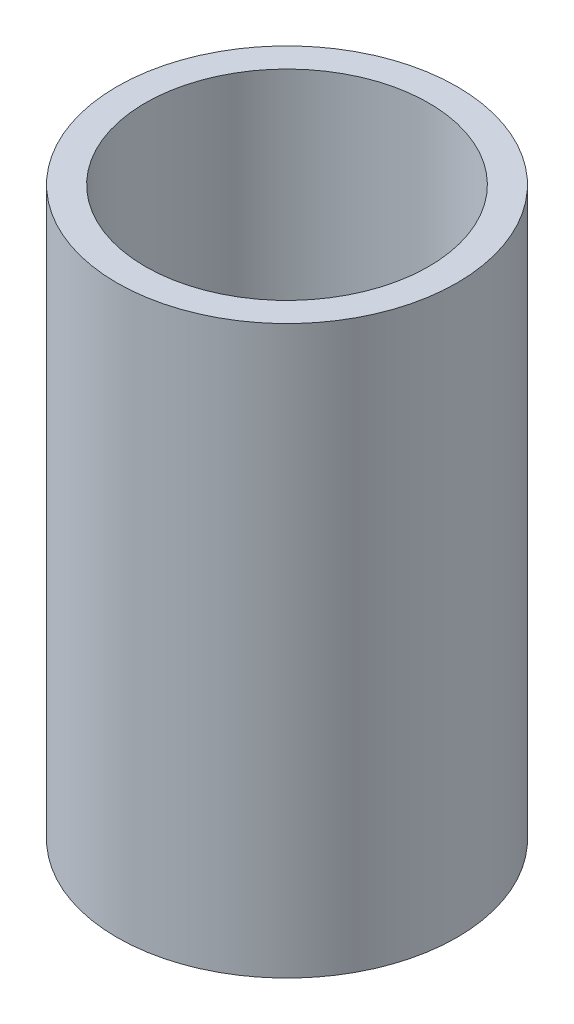
ISO-10303-21;
HEADER;
FILE_DESCRIPTION(('STEP AP214'),'2;1');
FILE_NAME('part.step','',(''),(''),'','','');
FILE_SCHEMA(('AUTOMOTIVE_DESIGN { 1 0 10303 214 1 1 1 1 }'));
ENDSEC;
DATA;
#1=APPLICATION_CONTEXT('core data for automotive mechanical design processes');
#2=APPLICATION_PROTOCOL_DEFINITION('international standard','automotive_design',2000,#1);
#3=PRODUCT_CONTEXT('',#1,'mechanical');
#4=PRODUCT('Part','Part','',(#3));
#5=PRODUCT_RELATED_PRODUCT_CATEGORY('part','',(#4));
#6=PRODUCT_DEFINITION_FORMATION('','',#4);
#7=PRODUCT_DEFINITION_CONTEXT('part definition',#1,'design');
#8=PRODUCT_DEFINITION('design','',#6,#7);
#9=PRODUCT_DEFINITION_SHAPE('','',#8);
#10=(LENGTH_UNIT() NAMED_UNIT(*) SI_UNIT(.MILLI.,.METRE.));
#11=(NAMED_UNIT(*) PLANE_ANGLE_UNIT() SI_UNIT($,.RADIAN.));
#12=(NAMED_UNIT(*) SI_UNIT($,.STERADIAN.) SOLID_ANGLE_UNIT());
#13=UNCERTAINTY_MEASURE_WITH_UNIT(LENGTH_MEASURE(1.E-05),#10,'distance_accuracy_value','');
#14=(GEOMETRIC_REPRESENTATION_CONTEXT(3) GLOBAL_UNCERTAINTY_ASSIGNED_CONTEXT((#13)) GLOBAL_UNIT_ASSIGNED_CONTEXT((#10,
#11,#12)) REPRESENTATION_CONTEXT('',''));
#15=CARTESIAN_POINT('',(0.,0.,0.));
#16=DIRECTION('',(0.,0.,1.));
#17=DIRECTION('',(1.,0.,0.));
#18=AXIS2_PLACEMENT_3D('',#15,#16,#17);
#19=CARTESIAN_POINT('',(0.,50.,0.));
#20=DIRECTION('',(0.,1.,0.));
#21=DIRECTION('',(0.,0.,1.));
#22=AXIS2_PLACEMENT_3D('',#19,#20,#21);
#23=PLANE('',#22);
#24=CARTESIAN_POINT('',(0.,50.,0.));
#25=DIRECTION('',(0.,1.,0.));
#26=DIRECTION('',(0.,0.,1.));
#27=AXIS2_PLACEMENT_3D('',#24,#25,#26);
#28=CIRCLE('',#27,15.);
#29=CARTESIAN_POINT('',(0.,50.,15.));
#30=VERTEX_POINT('',#29);
#31=EDGE_CURVE('E10',#30,#30,#28,.T.);
#32=ORIENTED_EDGE('',*,*,#31,.T.);
#33=EDGE_LOOP('',(#32));
#34=FACE_BOUND('',#33,.T.);
#35=CARTESIAN_POINT('',(0.,50.,0.));
#36=DIRECTION('',(0.,1.,0.));
#37=DIRECTION('',(0.,0.,1.));
#38=AXIS2_PLACEMENT_3D('',#35,#36,#37);
#39=CIRCLE('',#38,12.5);
#40=CARTESIAN_POINT('',(0.,50.,12.5));
#41=VERTEX_POINT('',#40);
#42=EDGE_CURVE('E42',#41,#41,#39,.T.);
#43=ORIENTED_EDGE('',*,*,#42,.F.);
#44=EDGE_LOOP('',(#43));
#45=FACE_BOUND('',#44,.T.);
#46=ADVANCED_FACE('F31',(#34,#45),#23,.T.);
#47=CARTESIAN_POINT('',(0.,0.,0.));
#48=DIRECTION('',(0.,1.,0.));
#49=DIRECTION('',(0.,0.,1.));
#50=AXIS2_PLACEMENT_3D('',#47,#48,#49);
#51=PLANE('',#50);
#52=CARTESIAN_POINT('',(0.,0.,0.));
#53=DIRECTION('',(0.,1.,0.));
#54=DIRECTION('',(0.,0.,1.));
#55=AXIS2_PLACEMENT_3D('',#52,#53,#54);
#56=CIRCLE('',#55,15.);
#57=CARTESIAN_POINT('',(0.,0.,15.));
#58=VERTEX_POINT('',#57);
#59=EDGE_CURVE('E35',#58,#58,#56,.T.);
#60=ORIENTED_EDGE('',*,*,#59,.F.);
#61=EDGE_LOOP('',(#60));
#62=FACE_BOUND('',#61,.T.);
#63=CARTESIAN_POINT('',(0.,0.,0.));
#64=DIRECTION('',(0.,1.,0.));
#65=DIRECTION('',(0.,0.,1.));
#66=AXIS2_PLACEMENT_3D('',#63,#64,#65);
#67=CIRCLE('',#66,12.5);
#68=CARTESIAN_POINT('',(0.,0.,12.5));
#69=VERTEX_POINT('',#68);
#70=EDGE_CURVE('E44',#69,#69,#67,.T.);
#71=ORIENTED_EDGE('',*,*,#70,.T.);
#72=EDGE_LOOP('',(#71));
#73=FACE_BOUND('',#72,.T.);
#74=ADVANCED_FACE('F54',(#62,#73),#51,.F.);
#75=CARTESIAN_POINT('',(0.,50.,0.));
#76=DIRECTION('',(0.,-1.,0.));
#77=DIRECTION('',(0.,0.,-1.));
#78=AXIS2_PLACEMENT_3D('',#75,#76,#77);
#79=CYLINDRICAL_SURFACE('',#78,15.);
#80=ORIENTED_EDGE('',*,*,#31,.F.);
#81=EDGE_LOOP('',(#80));
#82=FACE_BOUND('',#81,.T.);
#83=ORIENTED_EDGE('',*,*,#59,.T.);
#84=EDGE_LOOP('',(#83));
#85=FACE_BOUND('',#84,.T.);
#86=ADVANCED_FACE('F33',(#82,#85),#79,.T.);
#87=CARTESIAN_POINT('',(0.,50.,0.));
#88=DIRECTION('',(0.,-1.,0.));
#89=DIRECTION('',(0.,0.,-1.));
#90=AXIS2_PLACEMENT_3D('',#87,#88,#89);
#91=CYLINDRICAL_SURFACE('',#90,12.5);
#92=ORIENTED_EDGE('',*,*,#42,.T.);
#93=EDGE_LOOP('',(#92));
#94=FACE_BOUND('',#93,.T.);
#95=ORIENTED_EDGE('',*,*,#70,.F.);
#96=EDGE_LOOP('',(#95));
#97=FACE_BOUND('',#96,.T.);
#98=ADVANCED_FACE('F50',(#94,#97),#91,.F.);
#99=CLOSED_SHELL('',(#46,#74,#86,#98));
#100=MANIFOLD_SOLID_BREP('B2',#99);
#101=ADVANCED_BREP_SHAPE_REPRESENTATION('',(#18,#100),#14);
#102=SHAPE_DEFINITION_REPRESENTATION(#9,#101);
ENDSEC;
END-ISO-10303-21;
